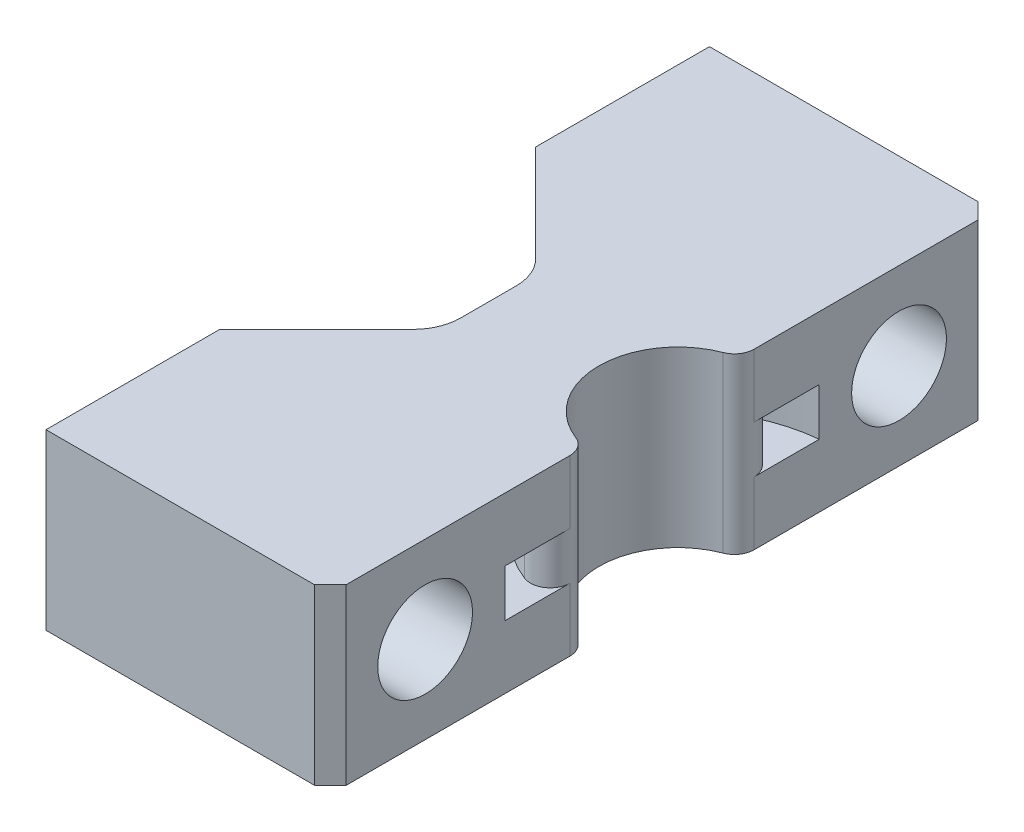
ISO-10303-21;
HEADER;
FILE_DESCRIPTION(('STEP AP214'),'2;1');
FILE_NAME('part.step','',(''),(''),'','','');
FILE_SCHEMA(('AUTOMOTIVE_DESIGN { 1 0 10303 214 1 1 1 1 }'));
ENDSEC;
DATA;
#1=APPLICATION_CONTEXT('core data for automotive mechanical design processes');
#2=APPLICATION_PROTOCOL_DEFINITION('international standard','automotive_design',2000,#1);
#3=PRODUCT_CONTEXT('',#1,'mechanical');
#4=PRODUCT('Part','Part','',(#3));
#5=PRODUCT_RELATED_PRODUCT_CATEGORY('part','',(#4));
#6=PRODUCT_DEFINITION_FORMATION('','',#4);
#7=PRODUCT_DEFINITION_CONTEXT('part definition',#1,'design');
#8=PRODUCT_DEFINITION('design','',#6,#7);
#9=PRODUCT_DEFINITION_SHAPE('','',#8);
#10=(LENGTH_UNIT() NAMED_UNIT(*) SI_UNIT(.MILLI.,.METRE.));
#11=(NAMED_UNIT(*) PLANE_ANGLE_UNIT() SI_UNIT($,.RADIAN.));
#12=(NAMED_UNIT(*) SI_UNIT($,.STERADIAN.) SOLID_ANGLE_UNIT());
#13=UNCERTAINTY_MEASURE_WITH_UNIT(LENGTH_MEASURE(1.E-05),#10,'distance_accuracy_value','');
#14=(GEOMETRIC_REPRESENTATION_CONTEXT(3) GLOBAL_UNCERTAINTY_ASSIGNED_CONTEXT((#13)) GLOBAL_UNIT_ASSIGNED_CONTEXT((#10,
#11,#12)) REPRESENTATION_CONTEXT('',''));
#15=CARTESIAN_POINT('',(0.,0.,0.));
#16=DIRECTION('',(0.,0.,1.));
#17=DIRECTION('',(1.,0.,0.));
#18=AXIS2_PLACEMENT_3D('',#15,#16,#17);
#19=CARTESIAN_POINT('',(89.0156764984131,100.94352722168,642.6));
#20=DIRECTION('',(-1.,0.,0.));
#21=DIRECTION('',(0.,0.,1.));
#22=AXIS2_PLACEMENT_3D('',#19,#20,#21);
#23=PLANE('',#22);
#24=CARTESIAN_POINT('',(89.0156764984131,100.94352722168,642.6));
#25=DIRECTION('',(-1.,0.,0.));
#26=DIRECTION('',(0.,0.,1.));
#27=AXIS2_PLACEMENT_3D('',#24,#25,#26);
#28=CIRCLE('',#27,3.);
#29=CARTESIAN_POINT('',(89.0156764984131,100.94352722168,645.6));
#30=VERTEX_POINT('',#29);
#31=EDGE_CURVE('E10',#30,#30,#28,.T.);
#32=ORIENTED_EDGE('',*,*,#31,.F.);
#33=EDGE_LOOP('',(#32));
#34=FACE_BOUND('',#33,.T.);
#35=CARTESIAN_POINT('',(89.0156764984131,100.94352722168,642.6));
#36=DIRECTION('',(1.,0.,0.));
#37=DIRECTION('',(0.,0.,-1.));
#38=AXIS2_PLACEMENT_3D('',#35,#36,#37);
#39=CIRCLE('',#38,1.725);
#40=CARTESIAN_POINT('',(89.0156764984131,100.94352722168,640.875));
#41=VERTEX_POINT('',#40);
#42=EDGE_CURVE('E25',#41,#41,#39,.T.);
#43=ORIENTED_EDGE('',*,*,#42,.F.);
#44=EDGE_LOOP('',(#43));
#45=FACE_BOUND('',#44,.T.);
#46=ADVANCED_FACE('F15',(#34,#45),#23,.F.);
#47=CARTESIAN_POINT('',(90.5156764984131,100.94352722168,642.6));
#48=DIRECTION('',(-1.,0.,0.));
#49=DIRECTION('',(0.,0.,1.));
#50=AXIS2_PLACEMENT_3D('',#47,#48,#49);
#51=CYLINDRICAL_SURFACE('',#50,3.);
#52=CARTESIAN_POINT('',(95.0156764984131,100.94352722168,642.6));
#53=DIRECTION('',(-1.,0.,0.));
#54=DIRECTION('',(0.,0.,1.));
#55=AXIS2_PLACEMENT_3D('',#52,#53,#54);
#56=CIRCLE('',#55,3.);
#57=CARTESIAN_POINT('',(95.0156764984131,100.94352722168,645.6));
#58=VERTEX_POINT('',#57);
#59=EDGE_CURVE('E254',#58,#58,#56,.T.);
#60=ORIENTED_EDGE('',*,*,#59,.F.);
#61=EDGE_LOOP('',(#60));
#62=FACE_BOUND('',#61,.T.);
#63=ORIENTED_EDGE('',*,*,#31,.T.);
#64=EDGE_LOOP('',(#63));
#65=FACE_BOUND('',#64,.T.);
#66=ADVANCED_FACE('F397',(#62,#65),#51,.F.);
#67=CARTESIAN_POINT('',(79.0156764984131,100.94352722168,642.6));
#68=DIRECTION('',(1.,0.,0.));
#69=DIRECTION('',(0.,0.,-1.));
#70=AXIS2_PLACEMENT_3D('',#67,#68,#69);
#71=CYLINDRICAL_SURFACE('',#70,1.725);
#72=CARTESIAN_POINT('',(77.0156764984131,100.94352722168,642.6));
#73=DIRECTION('',(1.,0.,0.));
#74=DIRECTION('',(0.,0.,-1.));
#75=AXIS2_PLACEMENT_3D('',#72,#73,#74);
#76=CIRCLE('',#75,1.725);
#77=CARTESIAN_POINT('',(77.0156764984131,100.94352722168,640.875));
#78=VERTEX_POINT('',#77);
#79=EDGE_CURVE('E186',#78,#78,#76,.T.);
#80=ORIENTED_EDGE('',*,*,#79,.F.);
#81=EDGE_LOOP('',(#80));
#82=FACE_BOUND('',#81,.T.);
#83=ORIENTED_EDGE('',*,*,#42,.T.);
#84=EDGE_LOOP('',(#83));
#85=FACE_BOUND('',#84,.T.);
#86=ADVANCED_FACE('F403',(#82,#85),#71,.F.);
#87=CARTESIAN_POINT('',(89.0156764984131,100.94352722168,672.6));
#88=DIRECTION('',(-1.,0.,0.));
#89=DIRECTION('',(0.,0.,1.));
#90=AXIS2_PLACEMENT_3D('',#87,#88,#89);
#91=PLANE('',#90);
#92=CARTESIAN_POINT('',(89.0156764984131,100.94352722168,672.6));
#93=DIRECTION('',(-1.,0.,0.));
#94=DIRECTION('',(0.,0.,1.));
#95=AXIS2_PLACEMENT_3D('',#92,#93,#94);
#96=CIRCLE('',#95,3.);
#97=CARTESIAN_POINT('',(89.0156764984131,100.94352722168,675.6));
#98=VERTEX_POINT('',#97);
#99=EDGE_CURVE('E584',#98,#98,#96,.T.);
#100=ORIENTED_EDGE('',*,*,#99,.F.);
#101=EDGE_LOOP('',(#100));
#102=FACE_BOUND('',#101,.T.);
#103=CARTESIAN_POINT('',(89.0156764984131,100.94352722168,672.6));
#104=DIRECTION('',(1.,0.,0.));
#105=DIRECTION('',(0.,0.,-1.));
#106=AXIS2_PLACEMENT_3D('',#103,#104,#105);
#107=CIRCLE('',#106,1.725);
#108=CARTESIAN_POINT('',(89.0156764984131,100.94352722168,670.875));
#109=VERTEX_POINT('',#108);
#110=EDGE_CURVE('E587',#109,#109,#107,.T.);
#111=ORIENTED_EDGE('',*,*,#110,.F.);
#112=EDGE_LOOP('',(#111));
#113=FACE_BOUND('',#112,.T.);
#114=ADVANCED_FACE('F411',(#102,#113),#91,.F.);
#115=CARTESIAN_POINT('',(90.5156764984131,100.94352722168,672.6));
#116=DIRECTION('',(-1.,0.,0.));
#117=DIRECTION('',(0.,0.,1.));
#118=AXIS2_PLACEMENT_3D('',#115,#116,#117);
#119=CYLINDRICAL_SURFACE('',#118,3.);
#120=CARTESIAN_POINT('',(95.0156764984131,100.94352722168,672.6));
#121=DIRECTION('',(-1.,0.,0.));
#122=DIRECTION('',(0.,0.,1.));
#123=AXIS2_PLACEMENT_3D('',#120,#121,#122);
#124=CIRCLE('',#123,3.);
#125=CARTESIAN_POINT('',(95.0156764984131,100.94352722168,675.6));
#126=VERTEX_POINT('',#125);
#127=EDGE_CURVE('E210',#126,#126,#124,.T.);
#128=ORIENTED_EDGE('',*,*,#127,.F.);
#129=EDGE_LOOP('',(#128));
#130=FACE_BOUND('',#129,.T.);
#131=ORIENTED_EDGE('',*,*,#99,.T.);
#132=EDGE_LOOP('',(#131));
#133=FACE_BOUND('',#132,.T.);
#134=ADVANCED_FACE('F415',(#130,#133),#119,.F.);
#135=CARTESIAN_POINT('',(79.0156764984131,100.94352722168,672.6));
#136=DIRECTION('',(1.,0.,0.));
#137=DIRECTION('',(0.,0.,-1.));
#138=AXIS2_PLACEMENT_3D('',#135,#136,#137);
#139=CYLINDRICAL_SURFACE('',#138,1.725);
#140=CARTESIAN_POINT('',(77.0156764984131,100.94352722168,672.6));
#141=DIRECTION('',(1.,0.,0.));
#142=DIRECTION('',(0.,0.,-1.));
#143=AXIS2_PLACEMENT_3D('',#140,#141,#142);
#144=CIRCLE('',#143,1.725);
#145=CARTESIAN_POINT('',(77.0156764984131,100.94352722168,670.875));
#146=VERTEX_POINT('',#145);
#147=EDGE_CURVE('E194',#146,#146,#144,.T.);
#148=ORIENTED_EDGE('',*,*,#147,.F.);
#149=EDGE_LOOP('',(#148));
#150=FACE_BOUND('',#149,.T.);
#151=ORIENTED_EDGE('',*,*,#110,.T.);
#152=EDGE_LOOP('',(#151));
#153=FACE_BOUND('',#152,.T.);
#154=ADVANCED_FACE('F419',(#150,#153),#139,.F.);
#155=CARTESIAN_POINT('',(81.0156764984131,100.44352722168,659.357359312881));
#156=DIRECTION('',(0.,-1.,0.));
#157=DIRECTION('',(0.923879532511289,0.,0.382683432365086));
#158=AXIS2_PLACEMENT_3D('',#155,#156,#157);
#159=CYLINDRICAL_SURFACE('',#158,3.);
#160=CARTESIAN_POINT('',(81.0156764984131,106.44352722168,659.357359312881));
#161=DIRECTION('',(0.,1.,0.));
#162=DIRECTION('',(0.923879532511289,0.,0.382683432365086));
#163=AXIS2_PLACEMENT_3D('',#160,#161,#162);
#164=CIRCLE('',#163,3.);
#165=CARTESIAN_POINT('',(83.1369968419727,106.44352722168,661.47867965644));
#166=VERTEX_POINT('',#165);
#167=CARTESIAN_POINT('',(84.0156764984131,106.44352722168,659.357359312881));
#168=VERTEX_POINT('',#167);
#169=EDGE_CURVE('E590',#166,#168,#164,.T.);
#170=ORIENTED_EDGE('',*,*,#169,.T.);
#171=DIRECTION('',(0.,-1.,0.));
#172=VECTOR('',#171,1.);
#173=CARTESIAN_POINT('',(84.0156764984131,100.44352722168,659.357359312881));
#174=LINE('',#173,#172);
#175=CARTESIAN_POINT('',(84.0156764984131,95.4435272216797,659.357359312881));
#176=VERTEX_POINT('',#175);
#177=EDGE_CURVE('E34',#168,#176,#174,.T.);
#178=ORIENTED_EDGE('',*,*,#177,.T.);
#179=CARTESIAN_POINT('',(81.0156764984131,95.4435272216797,659.357359312881));
#180=DIRECTION('',(0.,-1.,0.));
#181=DIRECTION('',(0.923879532511289,0.,0.382683432365086));
#182=AXIS2_PLACEMENT_3D('',#179,#180,#181);
#183=CIRCLE('',#182,3.);
#184=CARTESIAN_POINT('',(83.1369968419727,95.4435272216797,661.47867965644));
#185=VERTEX_POINT('',#184);
#186=EDGE_CURVE('E597',#176,#185,#183,.T.);
#187=ORIENTED_EDGE('',*,*,#186,.T.);
#188=DIRECTION('',(0.,1.,0.));
#189=VECTOR('',#188,1.);
#190=CARTESIAN_POINT('',(83.1369968419727,100.44352722168,661.47867965644));
#191=LINE('',#190,#189);
#192=EDGE_CURVE('E324',#185,#166,#191,.T.);
#193=ORIENTED_EDGE('',*,*,#192,.T.);
#194=EDGE_LOOP('',(#170,#178,#187,#193));
#195=FACE_BOUND('',#194,.T.);
#196=ADVANCED_FACE('F423',(#195),#159,.F.);
#197=CARTESIAN_POINT('',(84.0156764984131,100.44352722168,657.6));
#198=DIRECTION('',(-1.,0.,0.));
#199=DIRECTION('',(0.,0.,1.));
#200=AXIS2_PLACEMENT_3D('',#197,#198,#199);
#201=PLANE('',#200);
#202=ORIENTED_EDGE('',*,*,#177,.F.);
#203=DIRECTION('',(0.,0.,1.));
#204=VECTOR('',#203,1.);
#205=CARTESIAN_POINT('',(84.0156764984131,106.44352722168,657.6));
#206=LINE('',#205,#204);
#207=CARTESIAN_POINT('',(84.0156764984131,106.44352722168,655.842640687119));
#208=VERTEX_POINT('',#207);
#209=EDGE_CURVE('E262',#208,#168,#206,.T.);
#210=ORIENTED_EDGE('',*,*,#209,.F.);
#211=DIRECTION('',(0.,1.,0.));
#212=VECTOR('',#211,1.);
#213=CARTESIAN_POINT('',(84.0156764984131,100.44352722168,655.842640687119));
#214=LINE('',#213,#212);
#215=CARTESIAN_POINT('',(84.0156764984131,95.4435272216797,655.842640687119));
#216=VERTEX_POINT('',#215);
#217=EDGE_CURVE('E319',#216,#208,#214,.T.);
#218=ORIENTED_EDGE('',*,*,#217,.F.);
#219=DIRECTION('',(0.,0.,-1.));
#220=VECTOR('',#219,1.);
#221=CARTESIAN_POINT('',(84.0156764984131,95.4435272216797,657.6));
#222=LINE('',#221,#220);
#223=EDGE_CURVE('E310',#176,#216,#222,.T.);
#224=ORIENTED_EDGE('',*,*,#223,.F.);
#225=EDGE_LOOP('',(#202,#210,#218,#224));
#226=FACE_BOUND('',#225,.T.);
#227=ADVANCED_FACE('F427',(#226),#201,.T.);
#228=CARTESIAN_POINT('',(81.0156764984131,100.44352722168,655.842640687119));
#229=DIRECTION('',(0.,1.,0.));
#230=DIRECTION('',(0.923879532511289,0.,-0.382683432365086));
#231=AXIS2_PLACEMENT_3D('',#228,#229,#230);
#232=CYLINDRICAL_SURFACE('',#231,3.);
#233=CARTESIAN_POINT('',(81.0156764984131,95.4435272216797,655.842640687119));
#234=DIRECTION('',(0.,-1.,0.));
#235=DIRECTION('',(0.923879532511289,0.,-0.382683432365086));
#236=AXIS2_PLACEMENT_3D('',#233,#234,#235);
#237=CIRCLE('',#236,3.);
#238=CARTESIAN_POINT('',(83.1369968419727,95.4435272216797,653.721320343559));
#239=VERTEX_POINT('',#238);
#240=EDGE_CURVE('E321',#239,#216,#237,.T.);
#241=ORIENTED_EDGE('',*,*,#240,.T.);
#242=ORIENTED_EDGE('',*,*,#217,.T.);
#243=CARTESIAN_POINT('',(81.0156764984131,106.44352722168,655.842640687119));
#244=DIRECTION('',(0.,1.,0.));
#245=DIRECTION('',(0.923879532511289,0.,-0.382683432365086));
#246=AXIS2_PLACEMENT_3D('',#243,#244,#245);
#247=CIRCLE('',#246,3.);
#248=CARTESIAN_POINT('',(83.1369968419727,106.44352722168,653.721320343559));
#249=VERTEX_POINT('',#248);
#250=EDGE_CURVE('E325',#208,#249,#247,.T.);
#251=ORIENTED_EDGE('',*,*,#250,.T.);
#252=DIRECTION('',(0.,-1.,0.));
#253=VECTOR('',#252,1.);
#254=CARTESIAN_POINT('',(83.1369968419727,100.44352722168,653.721320343559));
#255=LINE('',#254,#253);
#256=EDGE_CURVE('E328',#249,#239,#255,.T.);
#257=ORIENTED_EDGE('',*,*,#256,.T.);
#258=EDGE_LOOP('',(#241,#242,#251,#257));
#259=FACE_BOUND('',#258,.T.);
#260=ADVANCED_FACE('F431',(#259),#232,.F.);
#261=CARTESIAN_POINT('',(80.5156764984131,100.44352722168,651.1));
#262=DIRECTION('',(-0.707106781186545,0.,0.70710678118655));
#263=DIRECTION('',(0.70710678118655,0.,0.707106781186545));
#264=AXIS2_PLACEMENT_3D('',#261,#262,#263);
#265=PLANE('',#264);
#266=ORIENTED_EDGE('',*,*,#256,.F.);
#267=DIRECTION('',(-0.70710678118655,0.,-0.707106781186545));
#268=VECTOR('',#267,1.);
#269=CARTESIAN_POINT('',(83.7656764984131,106.44352722168,654.35));
#270=LINE('',#269,#268);
#271=CARTESIAN_POINT('',(77.0156764984131,106.44352722168,647.6));
#272=VERTEX_POINT('',#271);
#273=EDGE_CURVE('E330',#249,#272,#270,.T.);
#274=ORIENTED_EDGE('',*,*,#273,.T.);
#275=DIRECTION('',(0.,1.,0.));
#276=VECTOR('',#275,1.);
#277=CARTESIAN_POINT('',(77.0156764984131,103.44352722168,647.6));
#278=LINE('',#277,#276);
#279=CARTESIAN_POINT('',(77.0156764984131,95.4435272216797,647.6));
#280=VERTEX_POINT('',#279);
#281=EDGE_CURVE('E289',#280,#272,#278,.T.);
#282=ORIENTED_EDGE('',*,*,#281,.F.);
#283=DIRECTION('',(0.70710678118655,0.,0.707106781186545));
#284=VECTOR('',#283,1.);
#285=CARTESIAN_POINT('',(83.7656764984131,95.4435272216797,654.35));
#286=LINE('',#285,#284);
#287=EDGE_CURVE('E332',#280,#239,#286,.T.);
#288=ORIENTED_EDGE('',*,*,#287,.T.);
#289=EDGE_LOOP('',(#266,#274,#282,#288));
#290=FACE_BOUND('',#289,.T.);
#291=ADVANCED_FACE('F360',(#290),#265,.T.);
#292=CARTESIAN_POINT('',(80.5156764984131,100.44352722168,664.1));
#293=DIRECTION('',(-0.707106781186545,0.,-0.70710678118655));
#294=DIRECTION('',(-0.70710678118655,0.,0.707106781186545));
#295=AXIS2_PLACEMENT_3D('',#292,#293,#294);
#296=PLANE('',#295);
#297=ORIENTED_EDGE('',*,*,#192,.F.);
#298=DIRECTION('',(-0.70710678118655,0.,0.707106781186545));
#299=VECTOR('',#298,1.);
#300=CARTESIAN_POINT('',(83.7656764984131,95.4435272216797,660.85));
#301=LINE('',#300,#299);
#302=CARTESIAN_POINT('',(77.0156764984131,95.4435272216797,667.6));
#303=VERTEX_POINT('',#302);
#304=EDGE_CURVE('E336',#185,#303,#301,.T.);
#305=ORIENTED_EDGE('',*,*,#304,.T.);
#306=DIRECTION('',(0.,-1.,0.));
#307=VECTOR('',#306,1.);
#308=CARTESIAN_POINT('',(77.0156764984131,103.44352722168,667.6));
#309=LINE('',#308,#307);
#310=CARTESIAN_POINT('',(77.0156764984131,106.44352722168,667.6));
#311=VERTEX_POINT('',#310);
#312=EDGE_CURVE('E192',#311,#303,#309,.T.);
#313=ORIENTED_EDGE('',*,*,#312,.F.);
#314=DIRECTION('',(0.70710678118655,0.,-0.707106781186545));
#315=VECTOR('',#314,1.);
#316=CARTESIAN_POINT('',(83.7656764984131,106.44352722168,660.85));
#317=LINE('',#316,#315);
#318=EDGE_CURVE('E184',#311,#166,#317,.T.);
#319=ORIENTED_EDGE('',*,*,#318,.T.);
#320=EDGE_LOOP('',(#297,#305,#313,#319));
#321=FACE_BOUND('',#320,.T.);
#322=ADVANCED_FACE('F437',(#321),#296,.T.);
#323=CARTESIAN_POINT('',(94.5156764984131,106.44352722168,637.1));
#324=DIRECTION('',(0.70710678118656,0.,-0.707106781186535));
#325=DIRECTION('',(-0.707106781186535,0.,-0.70710678118656));
#326=AXIS2_PLACEMENT_3D('',#323,#324,#325);
#327=PLANE('',#326);
#328=DIRECTION('',(0.707106781186535,0.,0.70710678118656));
#329=VECTOR('',#328,1.);
#330=CARTESIAN_POINT('',(97.7656764984132,106.44352722168,640.35));
#331=LINE('',#330,#329);
#332=CARTESIAN_POINT('',(94.0156764984131,106.44352722168,636.6));
#333=VERTEX_POINT('',#332);
#334=CARTESIAN_POINT('',(95.0156764984131,106.44352722168,637.6));
#335=VERTEX_POINT('',#334);
#336=EDGE_CURVE('E340',#333,#335,#331,.T.);
#337=ORIENTED_EDGE('',*,*,#336,.T.);
#338=DIRECTION('',(0.,-1.,0.));
#339=VECTOR('',#338,1.);
#340=CARTESIAN_POINT('',(95.0156764984131,106.44352722168,637.6));
#341=LINE('',#340,#339);
#342=CARTESIAN_POINT('',(95.0156764984131,95.4435272216797,637.6));
#343=VERTEX_POINT('',#342);
#344=EDGE_CURVE('E343',#335,#343,#341,.T.);
#345=ORIENTED_EDGE('',*,*,#344,.T.);
#346=DIRECTION('',(-0.707106781186535,0.,-0.70710678118656));
#347=VECTOR('',#346,1.);
#348=CARTESIAN_POINT('',(97.7656764984132,95.4435272216797,640.35));
#349=LINE('',#348,#347);
#350=CARTESIAN_POINT('',(94.0156764984131,95.4435272216797,636.6));
#351=VERTEX_POINT('',#350);
#352=EDGE_CURVE('E346',#343,#351,#349,.T.);
#353=ORIENTED_EDGE('',*,*,#352,.T.);
#354=DIRECTION('',(0.,1.,0.));
#355=VECTOR('',#354,1.);
#356=CARTESIAN_POINT('',(94.0156764984131,106.44352722168,636.6));
#357=LINE('',#356,#355);
#358=EDGE_CURVE('E348',#351,#333,#357,.T.);
#359=ORIENTED_EDGE('',*,*,#358,.T.);
#360=EDGE_LOOP('',(#337,#345,#353,#359));
#361=FACE_BOUND('',#360,.T.);
#362=ADVANCED_FACE('F364',(#361),#327,.T.);
#363=CARTESIAN_POINT('',(87.0156764984131,106.44352722168,636.6));
#364=DIRECTION('',(0.,0.,1.));
#365=DIRECTION('',(1.,0.,0.));
#366=AXIS2_PLACEMENT_3D('',#363,#364,#365);
#367=PLANE('',#366);
#368=ORIENTED_EDGE('',*,*,#358,.F.);
#369=DIRECTION('',(-1.,0.,0.));
#370=VECTOR('',#369,1.);
#371=CARTESIAN_POINT('',(87.0156764984131,95.4435272216797,636.6));
#372=LINE('',#371,#370);
#373=CARTESIAN_POINT('',(77.0156764984131,95.4435272216797,636.6));
#374=VERTEX_POINT('',#373);
#375=EDGE_CURVE('E297',#351,#374,#372,.T.);
#376=ORIENTED_EDGE('',*,*,#375,.T.);
#377=DIRECTION('',(0.,-1.,0.));
#378=VECTOR('',#377,1.);
#379=CARTESIAN_POINT('',(77.0156764984131,106.44352722168,636.6));
#380=LINE('',#379,#378);
#381=CARTESIAN_POINT('',(77.0156764984131,106.44352722168,636.6));
#382=VERTEX_POINT('',#381);
#383=EDGE_CURVE('E202',#382,#374,#380,.T.);
#384=ORIENTED_EDGE('',*,*,#383,.F.);
#385=DIRECTION('',(-1.,0.,0.));
#386=VECTOR('',#385,1.);
#387=CARTESIAN_POINT('',(87.0156764984131,106.44352722168,636.6));
#388=LINE('',#387,#386);
#389=EDGE_CURVE('E273',#333,#382,#388,.T.);
#390=ORIENTED_EDGE('',*,*,#389,.F.);
#391=EDGE_LOOP('',(#368,#376,#384,#390));
#392=FACE_BOUND('',#391,.T.);
#393=ADVANCED_FACE('F353',(#392),#367,.F.);
#394=CARTESIAN_POINT('',(87.0156764984131,95.4435272216797,657.6));
#395=DIRECTION('',(0.,1.,0.));
#396=DIRECTION('',(1.,0.,0.));
#397=AXIS2_PLACEMENT_3D('',#394,#395,#396);
#398=PLANE('',#397);
#399=ORIENTED_EDGE('',*,*,#352,.F.);
#400=DIRECTION('',(0.,0.,-1.));
#401=VECTOR('',#400,1.);
#402=CARTESIAN_POINT('',(95.0156764984131,95.4435272216797,657.6));
#403=LINE('',#402,#401);
#404=CARTESIAN_POINT('',(95.0156764984131,95.4435272216797,651.769048105154));
#405=VERTEX_POINT('',#404);
#406=EDGE_CURVE('E271',#405,#343,#403,.T.);
#407=ORIENTED_EDGE('',*,*,#406,.F.);
#408=CARTESIAN_POINT('',(93.765676498413,95.4435272216797,651.769048105154));
#409=DIRECTION('',(0.,1.,0.));
#410=DIRECTION('',(0.824621125123509,0.,0.565685424949272));
#411=AXIS2_PLACEMENT_3D('',#408,#409,#410);
#412=CIRCLE('',#411,1.25000000000008);
#413=CARTESIAN_POINT('',(94.2156764984131,95.4435272216797,652.935238484123));
#414=VERTEX_POINT('',#413);
#415=EDGE_CURVE('E259',#414,#405,#412,.T.);
#416=ORIENTED_EDGE('',*,*,#415,.F.);
#417=CARTESIAN_POINT('',(96.0156764984131,95.4435272216797,657.6));
#418=DIRECTION('',(0.,1.,0.));
#419=DIRECTION('',(1.,0.,0.));
#420=AXIS2_PLACEMENT_3D('',#417,#418,#419);
#421=CIRCLE('',#420,5.);
#422=CARTESIAN_POINT('',(94.2156764984131,95.4435272216797,662.264761515876));
#423=VERTEX_POINT('',#422);
#424=EDGE_CURVE('E304',#414,#423,#421,.T.);
#425=ORIENTED_EDGE('',*,*,#424,.T.);
#426=CARTESIAN_POINT('',(93.765676498413,95.4435272216797,663.430951894845));
#427=DIRECTION('',(0.,1.,0.));
#428=DIRECTION('',(0.824621125123509,0.,-0.565685424949272));
#429=AXIS2_PLACEMENT_3D('',#426,#427,#428);
#430=CIRCLE('',#429,1.25000000000008);
#431=CARTESIAN_POINT('',(95.0156764984131,95.4435272216797,663.430951894845));
#432=VERTEX_POINT('',#431);
#433=EDGE_CURVE('E215',#432,#423,#430,.T.);
#434=ORIENTED_EDGE('',*,*,#433,.F.);
#435=DIRECTION('',(0.,0.,-1.));
#436=VECTOR('',#435,1.);
#437=CARTESIAN_POINT('',(95.0156764984131,95.4435272216797,657.6));
#438=LINE('',#437,#436);
#439=CARTESIAN_POINT('',(95.0156764984131,95.4435272216797,677.6));
#440=VERTEX_POINT('',#439);
#441=EDGE_CURVE('E222',#440,#432,#438,.T.);
#442=ORIENTED_EDGE('',*,*,#441,.F.);
#443=DIRECTION('',(0.70710678118656,0.,-0.707106781186535));
#444=VECTOR('',#443,1.);
#445=CARTESIAN_POINT('',(97.765676498413,95.4435272216797,674.85));
#446=LINE('',#445,#444);
#447=CARTESIAN_POINT('',(94.0156764984131,95.4435272216797,678.6));
#448=VERTEX_POINT('',#447);
#449=EDGE_CURVE('E206',#448,#440,#446,.T.);
#450=ORIENTED_EDGE('',*,*,#449,.F.);
#451=DIRECTION('',(-1.,0.,0.));
#452=VECTOR('',#451,1.);
#453=CARTESIAN_POINT('',(87.0156764984131,95.4435272216797,678.6));
#454=LINE('',#453,#452);
#455=CARTESIAN_POINT('',(77.0156764984131,95.4435272216797,678.6));
#456=VERTEX_POINT('',#455);
#457=EDGE_CURVE('E198',#448,#456,#454,.T.);
#458=ORIENTED_EDGE('',*,*,#457,.T.);
#459=DIRECTION('',(0.,0.,1.));
#460=VECTOR('',#459,1.);
#461=CARTESIAN_POINT('',(77.0156764984131,95.4435272216797,657.6));
#462=LINE('',#461,#460);
#463=EDGE_CURVE('E190',#303,#456,#462,.T.);
#464=ORIENTED_EDGE('',*,*,#463,.F.);
#465=ORIENTED_EDGE('',*,*,#304,.F.);
#466=ORIENTED_EDGE('',*,*,#186,.F.);
#467=ORIENTED_EDGE('',*,*,#223,.T.);
#468=ORIENTED_EDGE('',*,*,#240,.F.);
#469=ORIENTED_EDGE('',*,*,#287,.F.);
#470=DIRECTION('',(0.,0.,1.));
#471=VECTOR('',#470,1.);
#472=CARTESIAN_POINT('',(77.0156764984131,95.4435272216797,657.6));
#473=LINE('',#472,#471);
#474=EDGE_CURVE('E176',#374,#280,#473,.T.);
#475=ORIENTED_EDGE('',*,*,#474,.F.);
#476=ORIENTED_EDGE('',*,*,#375,.F.);
#477=EDGE_LOOP('',(#399,#407,#416,#425,#434,#442,#450,#458,#464,#465,#466,#467,#468,#469,#475,#476));
#478=FACE_BOUND('',#477,.T.);
#479=ADVANCED_FACE('F356',(#478),#398,.F.);
#480=CARTESIAN_POINT('',(94.5156764984131,106.44352722168,678.1));
#481=DIRECTION('',(0.707106781186535,0.,0.70710678118656));
#482=DIRECTION('',(0.70710678118656,0.,-0.707106781186535));
#483=AXIS2_PLACEMENT_3D('',#480,#481,#482);
#484=PLANE('',#483);
#485=ORIENTED_EDGE('',*,*,#449,.T.);
#486=DIRECTION('',(0.,1.,0.));
#487=VECTOR('',#486,1.);
#488=CARTESIAN_POINT('',(95.0156764984131,106.44352722168,677.6));
#489=LINE('',#488,#487);
#490=CARTESIAN_POINT('',(95.0156764984131,106.44352722168,677.6));
#491=VERTEX_POINT('',#490);
#492=EDGE_CURVE('E203',#440,#491,#489,.T.);
#493=ORIENTED_EDGE('',*,*,#492,.T.);
#494=DIRECTION('',(-0.70710678118656,0.,0.707106781186535));
#495=VECTOR('',#494,1.);
#496=CARTESIAN_POINT('',(97.765676498413,106.44352722168,674.85));
#497=LINE('',#496,#495);
#498=CARTESIAN_POINT('',(94.0156764984131,106.44352722168,678.6));
#499=VERTEX_POINT('',#498);
#500=EDGE_CURVE('E207',#491,#499,#497,.T.);
#501=ORIENTED_EDGE('',*,*,#500,.T.);
#502=DIRECTION('',(0.,-1.,0.));
#503=VECTOR('',#502,1.);
#504=CARTESIAN_POINT('',(94.0156764984131,106.44352722168,678.6));
#505=LINE('',#504,#503);
#506=EDGE_CURVE('E173',#499,#448,#505,.T.);
#507=ORIENTED_EDGE('',*,*,#506,.T.);
#508=EDGE_LOOP('',(#485,#493,#501,#507));
#509=FACE_BOUND('',#508,.T.);
#510=ADVANCED_FACE('F384',(#509),#484,.T.);
#511=CARTESIAN_POINT('',(95.0156764984131,106.44352722168,657.6));
#512=DIRECTION('',(1.,0.,0.));
#513=DIRECTION('',(0.,0.,-1.));
#514=AXIS2_PLACEMENT_3D('',#511,#512,#513);
#515=PLANE('',#514);
#516=ORIENTED_EDGE('',*,*,#127,.T.);
#517=EDGE_LOOP('',(#516));
#518=FACE_BOUND('',#517,.T.);
#519=ORIENTED_EDGE('',*,*,#492,.F.);
#520=ORIENTED_EDGE('',*,*,#441,.T.);
#521=DIRECTION('',(0.,-1.,0.));
#522=VECTOR('',#521,1.);
#523=CARTESIAN_POINT('',(95.0156764984131,118.44352722168,663.430951894845));
#524=LINE('',#523,#522);
#525=CARTESIAN_POINT('',(95.0156764984131,99.4435272216797,663.430951894845));
#526=VERTEX_POINT('',#525);
#527=EDGE_CURVE('E211',#526,#432,#524,.T.);
#528=ORIENTED_EDGE('',*,*,#527,.F.);
#529=DIRECTION('',(0.,0.,-1.));
#530=VECTOR('',#529,1.);
#531=CARTESIAN_POINT('',(95.0156764984131,99.4435272216797,657.6));
#532=LINE('',#531,#530);
#533=CARTESIAN_POINT('',(95.0156764984131,99.4435272216797,667.549874371066));
#534=VERTEX_POINT('',#533);
#535=EDGE_CURVE('E216',#534,#526,#532,.T.);
#536=ORIENTED_EDGE('',*,*,#535,.F.);
#537=DIRECTION('',(0.,1.,0.));
#538=VECTOR('',#537,1.);
#539=CARTESIAN_POINT('',(95.0156764984131,99.4435272216797,667.549874371066));
#540=LINE('',#539,#538);
#541=CARTESIAN_POINT('',(95.0156764984131,102.44352722168,667.549874371066));
#542=VERTEX_POINT('',#541);
#543=EDGE_CURVE('E219',#534,#542,#540,.T.);
#544=ORIENTED_EDGE('',*,*,#543,.T.);
#545=DIRECTION('',(0.,0.,1.));
#546=VECTOR('',#545,1.);
#547=CARTESIAN_POINT('',(95.0156764984131,102.44352722168,657.6));
#548=LINE('',#547,#546);
#549=CARTESIAN_POINT('',(95.0156764984131,102.44352722168,663.430951894845));
#550=VERTEX_POINT('',#549);
#551=EDGE_CURVE('E224',#550,#542,#548,.T.);
#552=ORIENTED_EDGE('',*,*,#551,.F.);
#553=DIRECTION('',(0.,-1.,0.));
#554=VECTOR('',#553,1.);
#555=CARTESIAN_POINT('',(95.0156764984131,118.44352722168,663.430951894845));
#556=LINE('',#555,#554);
#557=CARTESIAN_POINT('',(95.0156764984131,106.44352722168,663.430951894845));
#558=VERTEX_POINT('',#557);
#559=EDGE_CURVE('E227',#558,#550,#556,.T.);
#560=ORIENTED_EDGE('',*,*,#559,.F.);
#561=DIRECTION('',(0.,0.,1.));
#562=VECTOR('',#561,1.);
#563=CARTESIAN_POINT('',(95.0156764984131,106.44352722168,657.6));
#564=LINE('',#563,#562);
#565=EDGE_CURVE('E223',#558,#491,#564,.T.);
#566=ORIENTED_EDGE('',*,*,#565,.T.);
#567=EDGE_LOOP('',(#519,#520,#528,#536,#544,#552,#560,#566));
#568=FACE_BOUND('',#567,.T.);
#569=ADVANCED_FACE('F383',(#518,#568),#515,.T.);
#570=CARTESIAN_POINT('',(96.0156764984131,99.4435272216797,657.6));
#571=DIRECTION('',(0.,-1.,0.));
#572=DIRECTION('',(1.,0.,0.));
#573=AXIS2_PLACEMENT_3D('',#570,#571,#572);
#574=CYLINDRICAL_SURFACE('',#573,7.5);
#575=DIRECTION('',(0.,-1.,0.));
#576=VECTOR('',#575,1.);
#577=CARTESIAN_POINT('',(93.315676498413,99.4435272216797,664.597142273814));
#578=LINE('',#577,#576);
#579=CARTESIAN_POINT('',(93.315676498413,102.44352722168,664.597142273814));
#580=VERTEX_POINT('',#579);
#581=CARTESIAN_POINT('',(93.315676498413,99.4435272216797,664.597142273814));
#582=VERTEX_POINT('',#581);
#583=EDGE_CURVE('E235',#580,#582,#578,.T.);
#584=ORIENTED_EDGE('',*,*,#583,.F.);
#585=CARTESIAN_POINT('',(96.0156764984131,102.44352722168,657.6));
#586=DIRECTION('',(0.,-1.,0.));
#587=DIRECTION('',(1.,0.,0.));
#588=AXIS2_PLACEMENT_3D('',#585,#586,#587);
#589=CIRCLE('',#588,7.5);
#590=CARTESIAN_POINT('',(93.315676498413,102.44352722168,650.602857726185));
#591=VERTEX_POINT('',#590);
#592=EDGE_CURVE('E234',#580,#591,#589,.T.);
#593=ORIENTED_EDGE('',*,*,#592,.T.);
#594=DIRECTION('',(0.,1.,0.));
#595=VECTOR('',#594,1.);
#596=CARTESIAN_POINT('',(93.315676498413,99.4435272216797,650.602857726185));
#597=LINE('',#596,#595);
#598=CARTESIAN_POINT('',(93.315676498413,99.4435272216797,650.602857726185));
#599=VERTEX_POINT('',#598);
#600=EDGE_CURVE('E240',#599,#591,#597,.T.);
#601=ORIENTED_EDGE('',*,*,#600,.F.);
#602=CARTESIAN_POINT('',(96.0156764984131,99.4435272216797,657.6));
#603=DIRECTION('',(0.,1.,0.));
#604=DIRECTION('',(1.,0.,0.));
#605=AXIS2_PLACEMENT_3D('',#602,#603,#604);
#606=CIRCLE('',#605,7.5);
#607=EDGE_CURVE('E239',#599,#582,#606,.T.);
#608=ORIENTED_EDGE('',*,*,#607,.T.);
#609=EDGE_LOOP('',(#584,#593,#601,#608));
#610=FACE_BOUND('',#609,.T.);
#611=ADVANCED_FACE('F392',(#610),#574,.T.);
#612=CARTESIAN_POINT('',(93.765676498413,118.44352722168,663.430951894845));
#613=DIRECTION('',(0.,1.,0.));
#614=DIRECTION('',(0.824621125123509,0.,-0.565685424949272));
#615=AXIS2_PLACEMENT_3D('',#612,#613,#614);
#616=CYLINDRICAL_SURFACE('',#615,1.25000000000008);
#617=CARTESIAN_POINT('',(93.765676498413,106.44352722168,663.430951894845));
#618=DIRECTION('',(0.,-1.,0.));
#619=DIRECTION('',(0.824621125123509,0.,-0.565685424949272));
#620=AXIS2_PLACEMENT_3D('',#617,#618,#619);
#621=CIRCLE('',#620,1.25000000000008);
#622=CARTESIAN_POINT('',(94.2156764984131,106.44352722168,662.264761515876));
#623=VERTEX_POINT('',#622);
#624=EDGE_CURVE('E230',#623,#558,#621,.T.);
#625=ORIENTED_EDGE('',*,*,#624,.T.);
#626=ORIENTED_EDGE('',*,*,#559,.T.);
#627=CARTESIAN_POINT('',(93.765676498413,102.44352722168,663.430951894845));
#628=DIRECTION('',(0.,-1.,0.));
#629=DIRECTION('',(0.565685424949296,0.,0.824621125123492));
#630=AXIS2_PLACEMENT_3D('',#627,#628,#629);
#631=CIRCLE('',#630,1.25000000000008);
#632=EDGE_CURVE('E231',#550,#580,#631,.T.);
#633=ORIENTED_EDGE('',*,*,#632,.T.);
#634=ORIENTED_EDGE('',*,*,#583,.T.);
#635=CARTESIAN_POINT('',(93.765676498413,99.4435272216797,663.430951894845));
#636=DIRECTION('',(0.,1.,0.));
#637=DIRECTION('',(0.565685424949296,0.,0.824621125123492));
#638=AXIS2_PLACEMENT_3D('',#635,#636,#637);
#639=CIRCLE('',#638,1.25000000000008);
#640=EDGE_CURVE('E214',#582,#526,#639,.T.);
#641=ORIENTED_EDGE('',*,*,#640,.T.);
#642=ORIENTED_EDGE('',*,*,#527,.T.);
#643=ORIENTED_EDGE('',*,*,#433,.T.);
#644=DIRECTION('',(0.,1.,0.));
#645=VECTOR('',#644,1.);
#646=CARTESIAN_POINT('',(94.2156764984131,118.44352722168,662.264761515876));
#647=LINE('',#646,#645);
#648=EDGE_CURVE('E252',#423,#623,#647,.T.);
#649=ORIENTED_EDGE('',*,*,#648,.T.);
#650=EDGE_LOOP('',(#625,#626,#633,#634,#641,#642,#643,#649));
#651=FACE_BOUND('',#650,.T.);
#652=ADVANCED_FACE('F379',(#651),#616,.T.);
#653=CARTESIAN_POINT('',(96.0156764984131,118.44352722168,657.6));
#654=DIRECTION('',(0.,-1.,0.));
#655=DIRECTION('',(1.,0.,0.));
#656=AXIS2_PLACEMENT_3D('',#653,#654,#655);
#657=CYLINDRICAL_SURFACE('',#656,5.);
#658=ORIENTED_EDGE('',*,*,#648,.F.);
#659=ORIENTED_EDGE('',*,*,#424,.F.);
#660=DIRECTION('',(0.,-1.,0.));
#661=VECTOR('',#660,1.);
#662=CARTESIAN_POINT('',(94.2156764984131,118.44352722168,652.935238484123));
#663=LINE('',#662,#661);
#664=CARTESIAN_POINT('',(94.2156764984131,106.44352722168,652.935238484123));
#665=VERTEX_POINT('',#664);
#666=EDGE_CURVE('E255',#665,#414,#663,.T.);
#667=ORIENTED_EDGE('',*,*,#666,.F.);
#668=CARTESIAN_POINT('',(96.0156764984131,106.44352722168,657.6));
#669=DIRECTION('',(0.,-1.,0.));
#670=DIRECTION('',(1.,0.,0.));
#671=AXIS2_PLACEMENT_3D('',#668,#669,#670);
#672=CIRCLE('',#671,5.);
#673=EDGE_CURVE('E260',#623,#665,#672,.T.);
#674=ORIENTED_EDGE('',*,*,#673,.F.);
#675=EDGE_LOOP('',(#658,#659,#667,#674));
#676=FACE_BOUND('',#675,.T.);
#677=ADVANCED_FACE('F372',(#676),#657,.F.);
#678=CARTESIAN_POINT('',(95.0156764984131,106.44352722168,657.6));
#679=DIRECTION('',(1.,0.,0.));
#680=DIRECTION('',(0.,0.,-1.));
#681=AXIS2_PLACEMENT_3D('',#678,#679,#680);
#682=PLANE('',#681);
#683=ORIENTED_EDGE('',*,*,#59,.T.);
#684=EDGE_LOOP('',(#683));
#685=FACE_BOUND('',#684,.T.);
#686=ORIENTED_EDGE('',*,*,#344,.F.);
#687=DIRECTION('',(0.,0.,1.));
#688=VECTOR('',#687,1.);
#689=CARTESIAN_POINT('',(95.0156764984131,106.44352722168,657.6));
#690=LINE('',#689,#688);
#691=CARTESIAN_POINT('',(95.0156764984131,106.44352722168,651.769048105154));
#692=VERTEX_POINT('',#691);
#693=EDGE_CURVE('E263',#335,#692,#690,.T.);
#694=ORIENTED_EDGE('',*,*,#693,.T.);
#695=DIRECTION('',(0.,1.,0.));
#696=VECTOR('',#695,1.);
#697=CARTESIAN_POINT('',(95.0156764984131,118.44352722168,651.769048105154));
#698=LINE('',#697,#696);
#699=CARTESIAN_POINT('',(95.0156764984131,102.44352722168,651.769048105155));
#700=VERTEX_POINT('',#699);
#701=EDGE_CURVE('E267',#700,#692,#698,.T.);
#702=ORIENTED_EDGE('',*,*,#701,.F.);
#703=DIRECTION('',(0.,0.,1.));
#704=VECTOR('',#703,1.);
#705=CARTESIAN_POINT('',(95.0156764984131,102.44352722168,657.6));
#706=LINE('',#705,#704);
#707=CARTESIAN_POINT('',(95.0156764984131,102.44352722168,647.650125628934));
#708=VERTEX_POINT('',#707);
#709=EDGE_CURVE('E218',#708,#700,#706,.T.);
#710=ORIENTED_EDGE('',*,*,#709,.F.);
#711=DIRECTION('',(0.,-1.,0.));
#712=VECTOR('',#711,1.);
#713=CARTESIAN_POINT('',(95.0156764984131,99.4435272216797,647.650125628934));
#714=LINE('',#713,#712);
#715=CARTESIAN_POINT('',(95.0156764984131,99.4435272216797,647.650125628934));
#716=VERTEX_POINT('',#715);
#717=EDGE_CURVE('E266',#708,#716,#714,.T.);
#718=ORIENTED_EDGE('',*,*,#717,.T.);
#719=DIRECTION('',(0.,0.,-1.));
#720=VECTOR('',#719,1.);
#721=CARTESIAN_POINT('',(95.0156764984131,99.4435272216797,657.6));
#722=LINE('',#721,#720);
#723=CARTESIAN_POINT('',(95.0156764984131,99.4435272216797,651.769048105155));
#724=VERTEX_POINT('',#723);
#725=EDGE_CURVE('E162',#724,#716,#722,.T.);
#726=ORIENTED_EDGE('',*,*,#725,.F.);
#727=DIRECTION('',(0.,1.,0.));
#728=VECTOR('',#727,1.);
#729=CARTESIAN_POINT('',(95.0156764984131,118.44352722168,651.769048105154));
#730=LINE('',#729,#728);
#731=EDGE_CURVE('E274',#405,#724,#730,.T.);
#732=ORIENTED_EDGE('',*,*,#731,.F.);
#733=ORIENTED_EDGE('',*,*,#406,.T.);
#734=EDGE_LOOP('',(#686,#694,#702,#710,#718,#726,#732,#733));
#735=FACE_BOUND('',#734,.T.);
#736=ADVANCED_FACE('F366',(#685,#735),#682,.T.);
#737=CARTESIAN_POINT('',(93.765676498413,99.4435272216797,651.769048105155));
#738=DIRECTION('',(0.,1.,0.));
#739=DIRECTION('',(0.565685424949296,0.,-0.824621125123492));
#740=AXIS2_PLACEMENT_3D('',#737,#738,#739);
#741=CYLINDRICAL_SURFACE('',#740,1.25000000000008);
#742=CARTESIAN_POINT('',(93.765676498413,99.4435272216797,651.769048105155));
#743=DIRECTION('',(0.,1.,0.));
#744=DIRECTION('',(0.565685424949296,0.,-0.824621125123492));
#745=AXIS2_PLACEMENT_3D('',#742,#743,#744);
#746=CIRCLE('',#745,1.25000000000008);
#747=EDGE_CURVE('E242',#724,#599,#746,.T.);
#748=ORIENTED_EDGE('',*,*,#747,.T.);
#749=ORIENTED_EDGE('',*,*,#600,.T.);
#750=CARTESIAN_POINT('',(93.765676498413,102.44352722168,651.769048105155));
#751=DIRECTION('',(0.,-1.,0.));
#752=DIRECTION('',(0.565685424949296,0.,-0.824621125123492));
#753=AXIS2_PLACEMENT_3D('',#750,#751,#752);
#754=CIRCLE('',#753,1.25000000000008);
#755=EDGE_CURVE('E243',#591,#700,#754,.T.);
#756=ORIENTED_EDGE('',*,*,#755,.T.);
#757=ORIENTED_EDGE('',*,*,#701,.T.);
#758=CARTESIAN_POINT('',(93.765676498413,106.44352722168,651.769048105154));
#759=DIRECTION('',(0.,-1.,0.));
#760=DIRECTION('',(0.824621125123509,0.,0.565685424949272));
#761=AXIS2_PLACEMENT_3D('',#758,#759,#760);
#762=CIRCLE('',#761,1.25000000000008);
#763=EDGE_CURVE('E258',#692,#665,#762,.T.);
#764=ORIENTED_EDGE('',*,*,#763,.T.);
#765=ORIENTED_EDGE('',*,*,#666,.T.);
#766=ORIENTED_EDGE('',*,*,#415,.T.);
#767=ORIENTED_EDGE('',*,*,#731,.T.);
#768=EDGE_LOOP('',(#748,#749,#756,#757,#764,#765,#766,#767));
#769=FACE_BOUND('',#768,.T.);
#770=ADVANCED_FACE('F374',(#769),#741,.T.);
#771=CARTESIAN_POINT('',(96.0156764984131,99.4435272216797,657.6));
#772=DIRECTION('',(0.,-1.,0.));
#773=DIRECTION('',(1.,0.,0.));
#774=AXIS2_PLACEMENT_3D('',#771,#772,#773);
#775=CYLINDRICAL_SURFACE('',#774,10.);
#776=ORIENTED_EDGE('',*,*,#543,.F.);
#777=CARTESIAN_POINT('',(96.0156764984131,99.4435272216797,657.6));
#778=DIRECTION('',(0.,-1.,0.));
#779=DIRECTION('',(1.,0.,0.));
#780=AXIS2_PLACEMENT_3D('',#777,#778,#779);
#781=CIRCLE('',#780,10.);
#782=EDGE_CURVE('E276',#534,#716,#781,.T.);
#783=ORIENTED_EDGE('',*,*,#782,.T.);
#784=ORIENTED_EDGE('',*,*,#717,.F.);
#785=CARTESIAN_POINT('',(96.0156764984131,102.44352722168,657.6));
#786=DIRECTION('',(0.,1.,0.));
#787=DIRECTION('',(1.,0.,0.));
#788=AXIS2_PLACEMENT_3D('',#785,#786,#787);
#789=CIRCLE('',#788,10.);
#790=EDGE_CURVE('E226',#708,#542,#789,.T.);
#791=ORIENTED_EDGE('',*,*,#790,.T.);
#792=EDGE_LOOP('',(#776,#783,#784,#791));
#793=FACE_BOUND('',#792,.T.);
#794=ADVANCED_FACE('F511',(#793),#775,.F.);
#795=CARTESIAN_POINT('',(96.0156764984131,102.44352722168,657.6));
#796=DIRECTION('',(0.,1.,0.));
#797=DIRECTION('',(-1.,0.,0.));
#798=AXIS2_PLACEMENT_3D('',#795,#796,#797);
#799=PLANE('',#798);
#800=ORIENTED_EDGE('',*,*,#551,.T.);
#801=ORIENTED_EDGE('',*,*,#790,.F.);
#802=ORIENTED_EDGE('',*,*,#709,.T.);
#803=ORIENTED_EDGE('',*,*,#755,.F.);
#804=ORIENTED_EDGE('',*,*,#592,.F.);
#805=ORIENTED_EDGE('',*,*,#632,.F.);
#806=EDGE_LOOP('',(#800,#801,#802,#803,#804,#805));
#807=FACE_BOUND('',#806,.T.);
#808=ADVANCED_FACE('F520',(#807),#799,.F.);
#809=CARTESIAN_POINT('',(96.0156764984131,99.4435272216797,657.6));
#810=DIRECTION('',(0.,-1.,0.));
#811=DIRECTION('',(1.,0.,0.));
#812=AXIS2_PLACEMENT_3D('',#809,#810,#811);
#813=PLANE('',#812);
#814=ORIENTED_EDGE('',*,*,#535,.T.);
#815=ORIENTED_EDGE('',*,*,#640,.F.);
#816=ORIENTED_EDGE('',*,*,#607,.F.);
#817=ORIENTED_EDGE('',*,*,#747,.F.);
#818=ORIENTED_EDGE('',*,*,#725,.T.);
#819=ORIENTED_EDGE('',*,*,#782,.F.);
#820=EDGE_LOOP('',(#814,#815,#816,#817,#818,#819));
#821=FACE_BOUND('',#820,.T.);
#822=ADVANCED_FACE('F530',(#821),#813,.F.);
#823=CARTESIAN_POINT('',(87.0156764984131,106.44352722168,657.6));
#824=DIRECTION('',(0.,-1.,0.));
#825=DIRECTION('',(-1.,0.,0.));
#826=AXIS2_PLACEMENT_3D('',#823,#824,#825);
#827=PLANE('',#826);
#828=ORIENTED_EDGE('',*,*,#336,.F.);
#829=ORIENTED_EDGE('',*,*,#389,.T.);
#830=DIRECTION('',(0.,0.,-1.));
#831=VECTOR('',#830,1.);
#832=CARTESIAN_POINT('',(77.0156764984131,106.44352722168,657.6));
#833=LINE('',#832,#831);
#834=EDGE_CURVE('E287',#272,#382,#833,.T.);
#835=ORIENTED_EDGE('',*,*,#834,.F.);
#836=ORIENTED_EDGE('',*,*,#273,.F.);
#837=ORIENTED_EDGE('',*,*,#250,.F.);
#838=ORIENTED_EDGE('',*,*,#209,.T.);
#839=ORIENTED_EDGE('',*,*,#169,.F.);
#840=ORIENTED_EDGE('',*,*,#318,.F.);
#841=DIRECTION('',(0.,0.,-1.));
#842=VECTOR('',#841,1.);
#843=CARTESIAN_POINT('',(77.0156764984131,106.44352722168,657.6));
#844=LINE('',#843,#842);
#845=CARTESIAN_POINT('',(77.0156764984131,106.44352722168,678.6));
#846=VERTEX_POINT('',#845);
#847=EDGE_CURVE('E179',#846,#311,#844,.T.);
#848=ORIENTED_EDGE('',*,*,#847,.F.);
#849=DIRECTION('',(-1.,0.,0.));
#850=VECTOR('',#849,1.);
#851=CARTESIAN_POINT('',(87.0156764984131,106.44352722168,678.6));
#852=LINE('',#851,#850);
#853=EDGE_CURVE('E168',#499,#846,#852,.T.);
#854=ORIENTED_EDGE('',*,*,#853,.F.);
#855=ORIENTED_EDGE('',*,*,#500,.F.);
#856=ORIENTED_EDGE('',*,*,#565,.F.);
#857=ORIENTED_EDGE('',*,*,#624,.F.);
#858=ORIENTED_EDGE('',*,*,#673,.T.);
#859=ORIENTED_EDGE('',*,*,#763,.F.);
#860=ORIENTED_EDGE('',*,*,#693,.F.);
#861=EDGE_LOOP('',(#828,#829,#835,#836,#837,#838,#839,#840,#848,#854,#855,#856,#857,#858,#859,#860));
#862=FACE_BOUND('',#861,.T.);
#863=ADVANCED_FACE('F181',(#862),#827,.F.);
#864=CARTESIAN_POINT('',(77.0156764984131,106.44352722168,657.6));
#865=DIRECTION('',(1.,0.,0.));
#866=DIRECTION('',(0.,0.,-1.));
#867=AXIS2_PLACEMENT_3D('',#864,#865,#866);
#868=PLANE('',#867);
#869=ORIENTED_EDGE('',*,*,#147,.T.);
#870=EDGE_LOOP('',(#869));
#871=FACE_BOUND('',#870,.T.);
#872=ORIENTED_EDGE('',*,*,#312,.T.);
#873=ORIENTED_EDGE('',*,*,#463,.T.);
#874=DIRECTION('',(0.,1.,0.));
#875=VECTOR('',#874,1.);
#876=CARTESIAN_POINT('',(77.0156764984131,106.44352722168,678.6));
#877=LINE('',#876,#875);
#878=EDGE_CURVE('E19',#456,#846,#877,.T.);
#879=ORIENTED_EDGE('',*,*,#878,.T.);
#880=ORIENTED_EDGE('',*,*,#847,.T.);
#881=EDGE_LOOP('',(#872,#873,#879,#880));
#882=FACE_BOUND('',#881,.T.);
#883=ADVANCED_FACE('F188',(#871,#882),#868,.F.);
#884=CARTESIAN_POINT('',(77.0156764984131,106.44352722168,657.6));
#885=DIRECTION('',(1.,0.,0.));
#886=DIRECTION('',(0.,0.,-1.));
#887=AXIS2_PLACEMENT_3D('',#884,#885,#886);
#888=PLANE('',#887);
#889=ORIENTED_EDGE('',*,*,#79,.T.);
#890=EDGE_LOOP('',(#889));
#891=FACE_BOUND('',#890,.T.);
#892=ORIENTED_EDGE('',*,*,#281,.T.);
#893=ORIENTED_EDGE('',*,*,#834,.T.);
#894=ORIENTED_EDGE('',*,*,#383,.T.);
#895=ORIENTED_EDGE('',*,*,#474,.T.);
#896=EDGE_LOOP('',(#892,#893,#894,#895));
#897=FACE_BOUND('',#896,.T.);
#898=ADVANCED_FACE('F357',(#891,#897),#888,.F.);
#899=CARTESIAN_POINT('',(87.0156764984131,106.44352722168,678.6));
#900=DIRECTION('',(0.,0.,-1.));
#901=DIRECTION('',(-1.,0.,0.));
#902=AXIS2_PLACEMENT_3D('',#899,#900,#901);
#903=PLANE('',#902);
#904=ORIENTED_EDGE('',*,*,#506,.F.);
#905=ORIENTED_EDGE('',*,*,#853,.T.);
#906=ORIENTED_EDGE('',*,*,#878,.F.);
#907=ORIENTED_EDGE('',*,*,#457,.F.);
#908=EDGE_LOOP('',(#904,#905,#906,#907));
#909=FACE_BOUND('',#908,.T.);
#910=ADVANCED_FACE('F17',(#909),#903,.F.);
#911=CLOSED_SHELL('',(#46,#66,#86,#114,#134,#154,#196,#227,#260,#291,#322,#362,#393,#479,#510,
#569,#611,#652,#677,#736,#770,#794,#808,#822,#863,#883,#898,#910));
#912=MANIFOLD_SOLID_BREP('B1',#911);
#913=ADVANCED_BREP_SHAPE_REPRESENTATION('',(#18,#912),#14);
#914=SHAPE_DEFINITION_REPRESENTATION(#9,#913);
ENDSEC;
END-ISO-10303-21;
